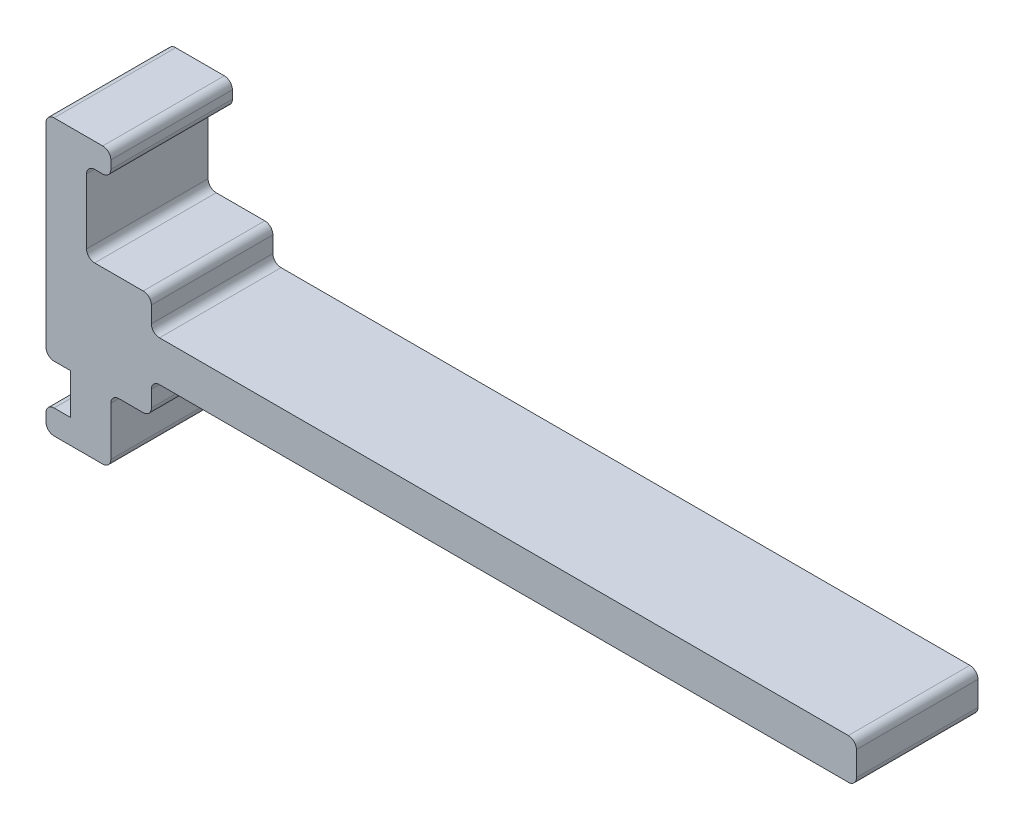
ISO-10303-21;
HEADER;
FILE_DESCRIPTION(('STEP AP214'),'2;1');
FILE_NAME('part.step','',(''),(''),'','','');
FILE_SCHEMA(('AUTOMOTIVE_DESIGN { 1 0 10303 214 1 1 1 1 }'));
ENDSEC;
DATA;
#1=APPLICATION_CONTEXT('core data for automotive mechanical design processes');
#2=APPLICATION_PROTOCOL_DEFINITION('international standard','automotive_design',2000,#1);
#3=PRODUCT_CONTEXT('',#1,'mechanical');
#4=PRODUCT('Part','Part','',(#3));
#5=PRODUCT_RELATED_PRODUCT_CATEGORY('part','',(#4));
#6=PRODUCT_DEFINITION_FORMATION('','',#4);
#7=PRODUCT_DEFINITION_CONTEXT('part definition',#1,'design');
#8=PRODUCT_DEFINITION('design','',#6,#7);
#9=PRODUCT_DEFINITION_SHAPE('','',#8);
#10=(LENGTH_UNIT() NAMED_UNIT(*) SI_UNIT(.MILLI.,.METRE.));
#11=(NAMED_UNIT(*) PLANE_ANGLE_UNIT() SI_UNIT($,.RADIAN.));
#12=(NAMED_UNIT(*) SI_UNIT($,.STERADIAN.) SOLID_ANGLE_UNIT());
#13=UNCERTAINTY_MEASURE_WITH_UNIT(LENGTH_MEASURE(1.E-05),#10,'distance_accuracy_value','');
#14=(GEOMETRIC_REPRESENTATION_CONTEXT(3) GLOBAL_UNCERTAINTY_ASSIGNED_CONTEXT((#13)) GLOBAL_UNIT_ASSIGNED_CONTEXT((#10,
#11,#12)) REPRESENTATION_CONTEXT('',''));
#15=CARTESIAN_POINT('',(0.,0.,0.));
#16=DIRECTION('',(0.,0.,1.));
#17=DIRECTION('',(1.,0.,0.));
#18=AXIS2_PLACEMENT_3D('',#15,#16,#17);
#19=CARTESIAN_POINT('',(-36.,3.5,7.5));
#20=DIRECTION('',(0.,0.,-1.));
#21=DIRECTION('',(-1.,0.,0.));
#22=AXIS2_PLACEMENT_3D('',#19,#20,#21);
#23=CYLINDRICAL_SURFACE('',#22,1.);
#24=CARTESIAN_POINT('',(-36.,3.5,-7.5));
#25=DIRECTION('',(0.,0.,1.));
#26=DIRECTION('',(1.,0.,0.));
#27=AXIS2_PLACEMENT_3D('',#24,#25,#26);
#28=CIRCLE('',#27,1.);
#29=CARTESIAN_POINT('',(-37.,3.50000000000001,-7.5));
#30=VERTEX_POINT('',#29);
#31=CARTESIAN_POINT('',(-36.,2.5,-7.5));
#32=VERTEX_POINT('',#31);
#33=EDGE_CURVE('E302',#30,#32,#28,.T.);
#34=ORIENTED_EDGE('',*,*,#33,.F.);
#35=DIRECTION('',(0.,0.,-1.));
#36=VECTOR('',#35,1.);
#37=CARTESIAN_POINT('',(-37.,3.50000000000001,7.5));
#38=LINE('',#37,#36);
#39=CARTESIAN_POINT('',(-37.,3.50000000000001,7.5));
#40=VERTEX_POINT('',#39);
#41=EDGE_CURVE('E11',#40,#30,#38,.T.);
#42=ORIENTED_EDGE('',*,*,#41,.F.);
#43=CARTESIAN_POINT('',(-36.,3.5,7.5));
#44=DIRECTION('',(0.,0.,1.));
#45=DIRECTION('',(1.,0.,0.));
#46=AXIS2_PLACEMENT_3D('',#43,#44,#45);
#47=CIRCLE('',#46,1.);
#48=CARTESIAN_POINT('',(-36.,2.5,7.5));
#49=VERTEX_POINT('',#48);
#50=EDGE_CURVE('E431',#40,#49,#47,.T.);
#51=ORIENTED_EDGE('',*,*,#50,.T.);
#52=DIRECTION('',(0.,0.,-1.));
#53=VECTOR('',#52,1.);
#54=CARTESIAN_POINT('',(-36.,2.5,7.5));
#55=LINE('',#54,#53);
#56=EDGE_CURVE('E46',#49,#32,#55,.T.);
#57=ORIENTED_EDGE('',*,*,#56,.T.);
#58=EDGE_LOOP('',(#34,#42,#51,#57));
#59=FACE_BOUND('',#58,.T.);
#60=ADVANCED_FACE('F43',(#59),#23,.F.);
#61=CARTESIAN_POINT('',(-37.,5.5,7.5));
#62=DIRECTION('',(1.,0.,0.));
#63=DIRECTION('',(0.,0.,-1.));
#64=AXIS2_PLACEMENT_3D('',#61,#62,#63);
#65=PLANE('',#64);
#66=DIRECTION('',(0.,-1.,0.));
#67=VECTOR('',#66,1.);
#68=CARTESIAN_POINT('',(-37.,5.5,-7.5));
#69=LINE('',#68,#67);
#70=CARTESIAN_POINT('',(-37.,5.5,-7.5));
#71=VERTEX_POINT('',#70);
#72=EDGE_CURVE('E428',#71,#30,#69,.T.);
#73=ORIENTED_EDGE('',*,*,#72,.F.);
#74=DIRECTION('',(0.,0.,-1.));
#75=VECTOR('',#74,1.);
#76=CARTESIAN_POINT('',(-37.,5.5,7.5));
#77=LINE('',#76,#75);
#78=CARTESIAN_POINT('',(-37.,5.5,7.5));
#79=VERTEX_POINT('',#78);
#80=EDGE_CURVE('E53',#79,#71,#77,.T.);
#81=ORIENTED_EDGE('',*,*,#80,.F.);
#82=DIRECTION('',(0.,-1.,0.));
#83=VECTOR('',#82,1.);
#84=CARTESIAN_POINT('',(-37.,5.5,7.5));
#85=LINE('',#84,#83);
#86=EDGE_CURVE('E279',#79,#40,#85,.T.);
#87=ORIENTED_EDGE('',*,*,#86,.T.);
#88=ORIENTED_EDGE('',*,*,#41,.T.);
#89=EDGE_LOOP('',(#73,#81,#87,#88));
#90=FACE_BOUND('',#89,.T.);
#91=ADVANCED_FACE('F533',(#90),#65,.T.);
#92=CARTESIAN_POINT('',(-38.,5.5,7.5));
#93=DIRECTION('',(0.,0.,-1.));
#94=DIRECTION('',(-1.,0.,0.));
#95=AXIS2_PLACEMENT_3D('',#92,#93,#94);
#96=CYLINDRICAL_SURFACE('',#95,1.);
#97=CARTESIAN_POINT('',(-38.,5.5,-7.5));
#98=DIRECTION('',(0.,0.,1.));
#99=DIRECTION('',(1.,0.,0.));
#100=AXIS2_PLACEMENT_3D('',#97,#98,#99);
#101=CIRCLE('',#100,1.);
#102=CARTESIAN_POINT('',(-38.,6.5,-7.5));
#103=VERTEX_POINT('',#102);
#104=EDGE_CURVE('E284',#71,#103,#101,.T.);
#105=ORIENTED_EDGE('',*,*,#104,.T.);
#106=DIRECTION('',(0.,0.,-1.));
#107=VECTOR('',#106,1.);
#108=CARTESIAN_POINT('',(-38.,6.5,7.5));
#109=LINE('',#108,#107);
#110=CARTESIAN_POINT('',(-38.,6.5,7.5));
#111=VERTEX_POINT('',#110);
#112=EDGE_CURVE('E282',#111,#103,#109,.T.);
#113=ORIENTED_EDGE('',*,*,#112,.F.);
#114=CARTESIAN_POINT('',(-38.,5.5,7.5));
#115=DIRECTION('',(0.,0.,1.));
#116=DIRECTION('',(1.,0.,0.));
#117=AXIS2_PLACEMENT_3D('',#114,#115,#116);
#118=CIRCLE('',#117,1.);
#119=EDGE_CURVE('E272',#79,#111,#118,.T.);
#120=ORIENTED_EDGE('',*,*,#119,.F.);
#121=ORIENTED_EDGE('',*,*,#80,.T.);
#122=EDGE_LOOP('',(#105,#113,#120,#121));
#123=FACE_BOUND('',#122,.T.);
#124=ADVANCED_FACE('F283',(#123),#96,.T.);
#125=CARTESIAN_POINT('',(-44.,6.5,7.5));
#126=DIRECTION('',(0.,1.,0.));
#127=DIRECTION('',(0.,0.,1.));
#128=AXIS2_PLACEMENT_3D('',#125,#126,#127);
#129=PLANE('',#128);
#130=DIRECTION('',(1.,0.,0.));
#131=VECTOR('',#130,1.);
#132=CARTESIAN_POINT('',(-44.,6.5,-7.5));
#133=LINE('',#132,#131);
#134=CARTESIAN_POINT('',(-44.,6.5,-7.5));
#135=VERTEX_POINT('',#134);
#136=EDGE_CURVE('E423',#135,#103,#133,.T.);
#137=ORIENTED_EDGE('',*,*,#136,.F.);
#138=DIRECTION('',(0.,0.,-1.));
#139=VECTOR('',#138,1.);
#140=CARTESIAN_POINT('',(-44.,6.5,7.5));
#141=LINE('',#140,#139);
#142=CARTESIAN_POINT('',(-44.,6.5,7.5));
#143=VERTEX_POINT('',#142);
#144=EDGE_CURVE('E289',#143,#135,#141,.T.);
#145=ORIENTED_EDGE('',*,*,#144,.F.);
#146=DIRECTION('',(1.,0.,0.));
#147=VECTOR('',#146,1.);
#148=CARTESIAN_POINT('',(-44.,6.5,7.5));
#149=LINE('',#148,#147);
#150=EDGE_CURVE('E277',#143,#111,#149,.T.);
#151=ORIENTED_EDGE('',*,*,#150,.T.);
#152=ORIENTED_EDGE('',*,*,#112,.T.);
#153=EDGE_LOOP('',(#137,#145,#151,#152));
#154=FACE_BOUND('',#153,.T.);
#155=ADVANCED_FACE('F291',(#154),#129,.T.);
#156=CARTESIAN_POINT('',(-44.,7.5,7.5));
#157=DIRECTION('',(0.,0.,-1.));
#158=DIRECTION('',(-1.,0.,0.));
#159=AXIS2_PLACEMENT_3D('',#156,#157,#158);
#160=CYLINDRICAL_SURFACE('',#159,1.);
#161=CARTESIAN_POINT('',(-44.,7.5,-7.5));
#162=DIRECTION('',(0.,0.,1.));
#163=DIRECTION('',(1.,0.,0.));
#164=AXIS2_PLACEMENT_3D('',#161,#162,#163);
#165=CIRCLE('',#164,1.);
#166=CARTESIAN_POINT('',(-45.,7.50000000000001,-7.5));
#167=VERTEX_POINT('',#166);
#168=EDGE_CURVE('E419',#167,#135,#165,.T.);
#169=ORIENTED_EDGE('',*,*,#168,.F.);
#170=DIRECTION('',(0.,0.,-1.));
#171=VECTOR('',#170,1.);
#172=CARTESIAN_POINT('',(-45.,7.50000000000001,7.5));
#173=LINE('',#172,#171);
#174=CARTESIAN_POINT('',(-45.,7.50000000000001,7.5));
#175=VERTEX_POINT('',#174);
#176=EDGE_CURVE('E437',#175,#167,#173,.T.);
#177=ORIENTED_EDGE('',*,*,#176,.F.);
#178=CARTESIAN_POINT('',(-44.,7.5,7.5));
#179=DIRECTION('',(0.,0.,1.));
#180=DIRECTION('',(1.,0.,0.));
#181=AXIS2_PLACEMENT_3D('',#178,#179,#180);
#182=CIRCLE('',#181,1.);
#183=EDGE_CURVE('E293',#175,#143,#182,.T.);
#184=ORIENTED_EDGE('',*,*,#183,.T.);
#185=ORIENTED_EDGE('',*,*,#144,.T.);
#186=EDGE_LOOP('',(#169,#177,#184,#185));
#187=FACE_BOUND('',#186,.T.);
#188=ADVANCED_FACE('F546',(#187),#160,.F.);
#189=CARTESIAN_POINT('',(-45.,15.5,7.5));
#190=DIRECTION('',(1.,0.,0.));
#191=DIRECTION('',(0.,0.,-1.));
#192=AXIS2_PLACEMENT_3D('',#189,#190,#191);
#193=PLANE('',#192);
#194=DIRECTION('',(0.,-1.,0.));
#195=VECTOR('',#194,1.);
#196=CARTESIAN_POINT('',(-45.,15.5,-7.5));
#197=LINE('',#196,#195);
#198=CARTESIAN_POINT('',(-45.,15.5,-7.5));
#199=VERTEX_POINT('',#198);
#200=EDGE_CURVE('E415',#199,#167,#197,.T.);
#201=ORIENTED_EDGE('',*,*,#200,.F.);
#202=DIRECTION('',(0.,0.,-1.));
#203=VECTOR('',#202,1.);
#204=CARTESIAN_POINT('',(-45.,15.5,7.5));
#205=LINE('',#204,#203);
#206=CARTESIAN_POINT('',(-45.,15.5,7.5));
#207=VERTEX_POINT('',#206);
#208=EDGE_CURVE('E440',#207,#199,#205,.T.);
#209=ORIENTED_EDGE('',*,*,#208,.F.);
#210=DIRECTION('',(0.,-1.,0.));
#211=VECTOR('',#210,1.);
#212=CARTESIAN_POINT('',(-45.,15.5,7.5));
#213=LINE('',#212,#211);
#214=EDGE_CURVE('E296',#207,#175,#213,.T.);
#215=ORIENTED_EDGE('',*,*,#214,.T.);
#216=ORIENTED_EDGE('',*,*,#176,.T.);
#217=EDGE_LOOP('',(#201,#209,#215,#216));
#218=FACE_BOUND('',#217,.T.);
#219=ADVANCED_FACE('F549',(#218),#193,.T.);
#220=CARTESIAN_POINT('',(-44.,15.5,7.5));
#221=DIRECTION('',(0.,0.,-1.));
#222=DIRECTION('',(-1.,0.,0.));
#223=AXIS2_PLACEMENT_3D('',#220,#221,#222);
#224=CYLINDRICAL_SURFACE('',#223,1.);
#225=CARTESIAN_POINT('',(-44.,15.5,-7.5));
#226=DIRECTION('',(0.,0.,1.));
#227=DIRECTION('',(1.,0.,0.));
#228=AXIS2_PLACEMENT_3D('',#225,#226,#227);
#229=CIRCLE('',#228,1.);
#230=CARTESIAN_POINT('',(-44.,16.5,-7.5));
#231=VERTEX_POINT('',#230);
#232=EDGE_CURVE('E411',#231,#199,#229,.T.);
#233=ORIENTED_EDGE('',*,*,#232,.F.);
#234=DIRECTION('',(0.,0.,-1.));
#235=VECTOR('',#234,1.);
#236=CARTESIAN_POINT('',(-44.,16.5,7.5));
#237=LINE('',#236,#235);
#238=CARTESIAN_POINT('',(-44.,16.5,7.5));
#239=VERTEX_POINT('',#238);
#240=EDGE_CURVE('E443',#239,#231,#237,.T.);
#241=ORIENTED_EDGE('',*,*,#240,.F.);
#242=CARTESIAN_POINT('',(-44.,15.5,7.5));
#243=DIRECTION('',(0.,0.,1.));
#244=DIRECTION('',(1.,0.,0.));
#245=AXIS2_PLACEMENT_3D('',#242,#243,#244);
#246=CIRCLE('',#245,1.);
#247=EDGE_CURVE('E1060',#239,#207,#246,.T.);
#248=ORIENTED_EDGE('',*,*,#247,.T.);
#249=ORIENTED_EDGE('',*,*,#208,.T.);
#250=EDGE_LOOP('',(#233,#241,#248,#249));
#251=FACE_BOUND('',#250,.T.);
#252=ADVANCED_FACE('F553',(#251),#224,.F.);
#253=CARTESIAN_POINT('',(-43.,16.5,7.5));
#254=DIRECTION('',(0.,-1.,0.));
#255=DIRECTION('',(0.,0.,-1.));
#256=AXIS2_PLACEMENT_3D('',#253,#254,#255);
#257=PLANE('',#256);
#258=DIRECTION('',(-1.,0.,0.));
#259=VECTOR('',#258,1.);
#260=CARTESIAN_POINT('',(-43.,16.5,-7.5));
#261=LINE('',#260,#259);
#262=CARTESIAN_POINT('',(-43.,16.5,-7.5));
#263=VERTEX_POINT('',#262);
#264=EDGE_CURVE('E407',#263,#231,#261,.T.);
#265=ORIENTED_EDGE('',*,*,#264,.F.);
#266=DIRECTION('',(0.,0.,-1.));
#267=VECTOR('',#266,1.);
#268=CARTESIAN_POINT('',(-43.,16.5,7.5));
#269=LINE('',#268,#267);
#270=CARTESIAN_POINT('',(-43.,16.5,7.5));
#271=VERTEX_POINT('',#270);
#272=EDGE_CURVE('E446',#271,#263,#269,.T.);
#273=ORIENTED_EDGE('',*,*,#272,.F.);
#274=DIRECTION('',(-1.,0.,0.));
#275=VECTOR('',#274,1.);
#276=CARTESIAN_POINT('',(-43.,16.5,7.5));
#277=LINE('',#276,#275);
#278=EDGE_CURVE('E1056',#271,#239,#277,.T.);
#279=ORIENTED_EDGE('',*,*,#278,.T.);
#280=ORIENTED_EDGE('',*,*,#240,.T.);
#281=EDGE_LOOP('',(#265,#273,#279,#280));
#282=FACE_BOUND('',#281,.T.);
#283=ADVANCED_FACE('F557',(#282),#257,.T.);
#284=CARTESIAN_POINT('',(-43.,17.5,7.5));
#285=DIRECTION('',(0.,0.,-1.));
#286=DIRECTION('',(-1.,0.,0.));
#287=AXIS2_PLACEMENT_3D('',#284,#285,#286);
#288=CYLINDRICAL_SURFACE('',#287,1.);
#289=CARTESIAN_POINT('',(-43.,17.5,-7.5));
#290=DIRECTION('',(0.,0.,1.));
#291=DIRECTION('',(1.,0.,0.));
#292=AXIS2_PLACEMENT_3D('',#289,#290,#291);
#293=CIRCLE('',#292,1.);
#294=CARTESIAN_POINT('',(-42.,17.5,-7.5));
#295=VERTEX_POINT('',#294);
#296=EDGE_CURVE('E403',#263,#295,#293,.T.);
#297=ORIENTED_EDGE('',*,*,#296,.T.);
#298=DIRECTION('',(0.,0.,-1.));
#299=VECTOR('',#298,1.);
#300=CARTESIAN_POINT('',(-42.,17.5,7.5));
#301=LINE('',#300,#299);
#302=CARTESIAN_POINT('',(-42.,17.5,7.5));
#303=VERTEX_POINT('',#302);
#304=EDGE_CURVE('E449',#303,#295,#301,.T.);
#305=ORIENTED_EDGE('',*,*,#304,.F.);
#306=CARTESIAN_POINT('',(-43.,17.5,7.5));
#307=DIRECTION('',(0.,0.,1.));
#308=DIRECTION('',(1.,0.,0.));
#309=AXIS2_PLACEMENT_3D('',#306,#307,#308);
#310=CIRCLE('',#309,1.);
#311=EDGE_CURVE('E1053',#271,#303,#310,.T.);
#312=ORIENTED_EDGE('',*,*,#311,.F.);
#313=ORIENTED_EDGE('',*,*,#272,.T.);
#314=EDGE_LOOP('',(#297,#305,#312,#313));
#315=FACE_BOUND('',#314,.T.);
#316=ADVANCED_FACE('F561',(#315),#288,.T.);
#317=CARTESIAN_POINT('',(-42.,18.5,7.5));
#318=DIRECTION('',(1.,0.,0.));
#319=DIRECTION('',(0.,0.,-1.));
#320=AXIS2_PLACEMENT_3D('',#317,#318,#319);
#321=PLANE('',#320);
#322=DIRECTION('',(0.,-1.,0.));
#323=VECTOR('',#322,1.);
#324=CARTESIAN_POINT('',(-42.,18.5,-7.5));
#325=LINE('',#324,#323);
#326=CARTESIAN_POINT('',(-42.,18.5,-7.5));
#327=VERTEX_POINT('',#326);
#328=EDGE_CURVE('E399',#327,#295,#325,.T.);
#329=ORIENTED_EDGE('',*,*,#328,.F.);
#330=DIRECTION('',(0.,0.,-1.));
#331=VECTOR('',#330,1.);
#332=CARTESIAN_POINT('',(-42.,18.5,7.5));
#333=LINE('',#332,#331);
#334=CARTESIAN_POINT('',(-42.,18.5,7.5));
#335=VERTEX_POINT('',#334);
#336=EDGE_CURVE('E452',#335,#327,#333,.T.);
#337=ORIENTED_EDGE('',*,*,#336,.F.);
#338=DIRECTION('',(0.,-1.,0.));
#339=VECTOR('',#338,1.);
#340=CARTESIAN_POINT('',(-42.,18.5,7.5));
#341=LINE('',#340,#339);
#342=EDGE_CURVE('E1045',#335,#303,#341,.T.);
#343=ORIENTED_EDGE('',*,*,#342,.T.);
#344=ORIENTED_EDGE('',*,*,#304,.T.);
#345=EDGE_LOOP('',(#329,#337,#343,#344));
#346=FACE_BOUND('',#345,.T.);
#347=ADVANCED_FACE('F565',(#346),#321,.T.);
#348=CARTESIAN_POINT('',(-43.,18.5,7.5));
#349=DIRECTION('',(0.,0.,-1.));
#350=DIRECTION('',(-1.,0.,0.));
#351=AXIS2_PLACEMENT_3D('',#348,#349,#350);
#352=CYLINDRICAL_SURFACE('',#351,1.);
#353=CARTESIAN_POINT('',(-43.,18.5,-7.5));
#354=DIRECTION('',(0.,0.,1.));
#355=DIRECTION('',(1.,0.,0.));
#356=AXIS2_PLACEMENT_3D('',#353,#354,#355);
#357=CIRCLE('',#356,1.);
#358=CARTESIAN_POINT('',(-43.,19.5,-7.5));
#359=VERTEX_POINT('',#358);
#360=EDGE_CURVE('E395',#327,#359,#357,.T.);
#361=ORIENTED_EDGE('',*,*,#360,.T.);
#362=DIRECTION('',(0.,0.,-1.));
#363=VECTOR('',#362,1.);
#364=CARTESIAN_POINT('',(-43.,19.5,7.5));
#365=LINE('',#364,#363);
#366=CARTESIAN_POINT('',(-43.,19.5,7.5));
#367=VERTEX_POINT('',#366);
#368=EDGE_CURVE('E455',#367,#359,#365,.T.);
#369=ORIENTED_EDGE('',*,*,#368,.F.);
#370=CARTESIAN_POINT('',(-43.,18.5,7.5));
#371=DIRECTION('',(0.,0.,1.));
#372=DIRECTION('',(1.,0.,0.));
#373=AXIS2_PLACEMENT_3D('',#370,#371,#372);
#374=CIRCLE('',#373,1.);
#375=EDGE_CURVE('E1039',#335,#367,#374,.T.);
#376=ORIENTED_EDGE('',*,*,#375,.F.);
#377=ORIENTED_EDGE('',*,*,#336,.T.);
#378=EDGE_LOOP('',(#361,#369,#376,#377));
#379=FACE_BOUND('',#378,.T.);
#380=ADVANCED_FACE('F569',(#379),#352,.T.);
#381=CARTESIAN_POINT('',(-45.,19.5,7.5));
#382=DIRECTION('',(0.,1.,0.));
#383=DIRECTION('',(0.,0.,1.));
#384=AXIS2_PLACEMENT_3D('',#381,#382,#383);
#385=PLANE('',#384);
#386=DIRECTION('',(1.,0.,0.));
#387=VECTOR('',#386,1.);
#388=CARTESIAN_POINT('',(-45.,19.5,-7.5));
#389=LINE('',#388,#387);
#390=CARTESIAN_POINT('',(-49.,19.5,-7.5));
#391=VERTEX_POINT('',#390);
#392=EDGE_CURVE('E391',#391,#359,#389,.T.);
#393=ORIENTED_EDGE('',*,*,#392,.F.);
#394=DIRECTION('',(0.,0.,-1.));
#395=VECTOR('',#394,1.);
#396=CARTESIAN_POINT('',(-49.,19.5,7.5));
#397=LINE('',#396,#395);
#398=CARTESIAN_POINT('',(-49.,19.5,7.5));
#399=VERTEX_POINT('',#398);
#400=EDGE_CURVE('E458',#399,#391,#397,.T.);
#401=ORIENTED_EDGE('',*,*,#400,.F.);
#402=DIRECTION('',(1.,0.,0.));
#403=VECTOR('',#402,1.);
#404=CARTESIAN_POINT('',(-49.,19.5,7.5));
#405=LINE('',#404,#403);
#406=EDGE_CURVE('E1035',#399,#367,#405,.T.);
#407=ORIENTED_EDGE('',*,*,#406,.T.);
#408=ORIENTED_EDGE('',*,*,#368,.T.);
#409=EDGE_LOOP('',(#393,#401,#407,#408));
#410=FACE_BOUND('',#409,.T.);
#411=ADVANCED_FACE('F573',(#410),#385,.T.);
#412=CARTESIAN_POINT('',(-49.,18.5,7.5));
#413=DIRECTION('',(0.,0.,-1.));
#414=DIRECTION('',(-1.,0.,0.));
#415=AXIS2_PLACEMENT_3D('',#412,#413,#414);
#416=CYLINDRICAL_SURFACE('',#415,1.);
#417=CARTESIAN_POINT('',(-49.,18.5,-7.5));
#418=DIRECTION('',(0.,0.,-1.));
#419=DIRECTION('',(-1.,0.,0.));
#420=AXIS2_PLACEMENT_3D('',#417,#418,#419);
#421=CIRCLE('',#420,1.);
#422=CARTESIAN_POINT('',(-50.,18.5,-7.5));
#423=VERTEX_POINT('',#422);
#424=EDGE_CURVE('E387',#423,#391,#421,.T.);
#425=ORIENTED_EDGE('',*,*,#424,.F.);
#426=DIRECTION('',(0.,0.,-1.));
#427=VECTOR('',#426,1.);
#428=CARTESIAN_POINT('',(-50.,18.5,7.5));
#429=LINE('',#428,#427);
#430=CARTESIAN_POINT('',(-50.,18.5,7.5));
#431=VERTEX_POINT('',#430);
#432=EDGE_CURVE('E462',#431,#423,#429,.T.);
#433=ORIENTED_EDGE('',*,*,#432,.F.);
#434=CARTESIAN_POINT('',(-49.,18.5,7.5));
#435=DIRECTION('',(0.,0.,-1.));
#436=DIRECTION('',(-1.,0.,0.));
#437=AXIS2_PLACEMENT_3D('',#434,#435,#436);
#438=CIRCLE('',#437,1.);
#439=EDGE_CURVE('E1033',#431,#399,#438,.T.);
#440=ORIENTED_EDGE('',*,*,#439,.T.);
#441=ORIENTED_EDGE('',*,*,#400,.T.);
#442=EDGE_LOOP('',(#425,#433,#440,#441));
#443=FACE_BOUND('',#442,.T.);
#444=ADVANCED_FACE('F577',(#443),#416,.T.);
#445=CARTESIAN_POINT('',(-50.,2.5,7.5));
#446=DIRECTION('',(-1.,0.,0.));
#447=DIRECTION('',(0.,0.,1.));
#448=AXIS2_PLACEMENT_3D('',#445,#446,#447);
#449=PLANE('',#448);
#450=DIRECTION('',(0.,1.,0.));
#451=VECTOR('',#450,1.);
#452=CARTESIAN_POINT('',(-50.,2.5,-7.5));
#453=LINE('',#452,#451);
#454=CARTESIAN_POINT('',(-50.,-5.5,-7.5));
#455=VERTEX_POINT('',#454);
#456=EDGE_CURVE('E383',#455,#423,#453,.T.);
#457=ORIENTED_EDGE('',*,*,#456,.F.);
#458=DIRECTION('',(0.,0.,-1.));
#459=VECTOR('',#458,1.);
#460=CARTESIAN_POINT('',(-50.,-5.5,7.5));
#461=LINE('',#460,#459);
#462=CARTESIAN_POINT('',(-50.,-5.5,7.5));
#463=VERTEX_POINT('',#462);
#464=EDGE_CURVE('E465',#463,#455,#461,.T.);
#465=ORIENTED_EDGE('',*,*,#464,.F.);
#466=DIRECTION('',(0.,-1.,0.));
#467=VECTOR('',#466,1.);
#468=CARTESIAN_POINT('',(-50.,-2.5,7.5));
#469=LINE('',#468,#467);
#470=EDGE_CURVE('E1030',#431,#463,#469,.T.);
#471=ORIENTED_EDGE('',*,*,#470,.F.);
#472=ORIENTED_EDGE('',*,*,#432,.T.);
#473=EDGE_LOOP('',(#457,#465,#471,#472));
#474=FACE_BOUND('',#473,.T.);
#475=ADVANCED_FACE('F581',(#474),#449,.T.);
#476=CARTESIAN_POINT('',(-49.,-5.5,7.5));
#477=DIRECTION('',(0.,0.,-1.));
#478=DIRECTION('',(-1.,0.,0.));
#479=AXIS2_PLACEMENT_3D('',#476,#477,#478);
#480=CYLINDRICAL_SURFACE('',#479,1.);
#481=CARTESIAN_POINT('',(-49.,-5.5,-7.5));
#482=DIRECTION('',(0.,0.,-1.));
#483=DIRECTION('',(-1.,0.,0.));
#484=AXIS2_PLACEMENT_3D('',#481,#482,#483);
#485=CIRCLE('',#484,1.);
#486=CARTESIAN_POINT('',(-49.,-6.5,-7.5));
#487=VERTEX_POINT('',#486);
#488=EDGE_CURVE('E379',#487,#455,#485,.T.);
#489=ORIENTED_EDGE('',*,*,#488,.F.);
#490=DIRECTION('',(0.,0.,-1.));
#491=VECTOR('',#490,1.);
#492=CARTESIAN_POINT('',(-49.,-6.5,7.5));
#493=LINE('',#492,#491);
#494=CARTESIAN_POINT('',(-49.,-6.5,7.5));
#495=VERTEX_POINT('',#494);
#496=EDGE_CURVE('E469',#495,#487,#493,.T.);
#497=ORIENTED_EDGE('',*,*,#496,.F.);
#498=CARTESIAN_POINT('',(-49.,-5.5,7.5));
#499=DIRECTION('',(0.,0.,-1.));
#500=DIRECTION('',(-1.,0.,0.));
#501=AXIS2_PLACEMENT_3D('',#498,#499,#500);
#502=CIRCLE('',#501,1.);
#503=EDGE_CURVE('E1026',#495,#463,#502,.T.);
#504=ORIENTED_EDGE('',*,*,#503,.T.);
#505=ORIENTED_EDGE('',*,*,#464,.T.);
#506=EDGE_LOOP('',(#489,#497,#504,#505));
#507=FACE_BOUND('',#506,.T.);
#508=ADVANCED_FACE('F585',(#507),#480,.T.);
#509=CARTESIAN_POINT('',(-49.,-6.5,7.5));
#510=DIRECTION('',(0.,1.,0.));
#511=DIRECTION('',(0.,0.,1.));
#512=AXIS2_PLACEMENT_3D('',#509,#510,#511);
#513=PLANE('',#512);
#514=DIRECTION('',(1.,0.,0.));
#515=VECTOR('',#514,1.);
#516=CARTESIAN_POINT('',(-49.,-6.5,-7.5));
#517=LINE('',#516,#515);
#518=CARTESIAN_POINT('',(-47.,-6.5,-7.5));
#519=VERTEX_POINT('',#518);
#520=EDGE_CURVE('E376',#487,#519,#517,.T.);
#521=ORIENTED_EDGE('',*,*,#520,.T.);
#522=DIRECTION('',(0.,0.,-1.));
#523=VECTOR('',#522,1.);
#524=CARTESIAN_POINT('',(-47.,-6.5,7.5));
#525=LINE('',#524,#523);
#526=CARTESIAN_POINT('',(-47.,-6.5,7.5));
#527=VERTEX_POINT('',#526);
#528=EDGE_CURVE('E472',#527,#519,#525,.T.);
#529=ORIENTED_EDGE('',*,*,#528,.F.);
#530=DIRECTION('',(1.,0.,0.));
#531=VECTOR('',#530,1.);
#532=CARTESIAN_POINT('',(-49.,-6.5,7.5));
#533=LINE('',#532,#531);
#534=EDGE_CURVE('E1023',#495,#527,#533,.T.);
#535=ORIENTED_EDGE('',*,*,#534,.F.);
#536=ORIENTED_EDGE('',*,*,#496,.T.);
#537=EDGE_LOOP('',(#521,#529,#535,#536));
#538=FACE_BOUND('',#537,.T.);
#539=ADVANCED_FACE('F589',(#538),#513,.F.);
#540=CARTESIAN_POINT('',(-47.,-6.5,7.5));
#541=DIRECTION('',(1.,0.,0.));
#542=DIRECTION('',(0.,0.,-1.));
#543=AXIS2_PLACEMENT_3D('',#540,#541,#542);
#544=PLANE('',#543);
#545=DIRECTION('',(0.,-1.,0.));
#546=VECTOR('',#545,1.);
#547=CARTESIAN_POINT('',(-47.,-6.5,-7.5));
#548=LINE('',#547,#546);
#549=CARTESIAN_POINT('',(-47.,-11.5,-7.5));
#550=VERTEX_POINT('',#549);
#551=EDGE_CURVE('E373',#519,#550,#548,.T.);
#552=ORIENTED_EDGE('',*,*,#551,.T.);
#553=DIRECTION('',(0.,0.,-1.));
#554=VECTOR('',#553,1.);
#555=CARTESIAN_POINT('',(-47.,-11.5,7.5));
#556=LINE('',#555,#554);
#557=CARTESIAN_POINT('',(-47.,-11.5,7.5));
#558=VERTEX_POINT('',#557);
#559=EDGE_CURVE('E476',#558,#550,#556,.T.);
#560=ORIENTED_EDGE('',*,*,#559,.F.);
#561=DIRECTION('',(0.,-1.,0.));
#562=VECTOR('',#561,1.);
#563=CARTESIAN_POINT('',(-47.,-6.5,7.5));
#564=LINE('',#563,#562);
#565=EDGE_CURVE('E1021',#527,#558,#564,.T.);
#566=ORIENTED_EDGE('',*,*,#565,.F.);
#567=ORIENTED_EDGE('',*,*,#528,.T.);
#568=EDGE_LOOP('',(#552,#560,#566,#567));
#569=FACE_BOUND('',#568,.T.);
#570=ADVANCED_FACE('F593',(#569),#544,.F.);
#571=CARTESIAN_POINT('',(-47.,-11.5,7.5));
#572=DIRECTION('',(0.,-1.,0.));
#573=DIRECTION('',(0.,0.,-1.));
#574=AXIS2_PLACEMENT_3D('',#571,#572,#573);
#575=PLANE('',#574);
#576=DIRECTION('',(-1.,0.,0.));
#577=VECTOR('',#576,1.);
#578=CARTESIAN_POINT('',(-47.,-11.5,-7.5));
#579=LINE('',#578,#577);
#580=CARTESIAN_POINT('',(-49.,-11.5,-7.5));
#581=VERTEX_POINT('',#580);
#582=EDGE_CURVE('E369',#550,#581,#579,.T.);
#583=ORIENTED_EDGE('',*,*,#582,.T.);
#584=DIRECTION('',(0.,0.,-1.));
#585=VECTOR('',#584,1.);
#586=CARTESIAN_POINT('',(-49.,-11.5,7.5));
#587=LINE('',#586,#585);
#588=CARTESIAN_POINT('',(-49.,-11.5,7.5));
#589=VERTEX_POINT('',#588);
#590=EDGE_CURVE('E480',#589,#581,#587,.T.);
#591=ORIENTED_EDGE('',*,*,#590,.F.);
#592=DIRECTION('',(-1.,0.,0.));
#593=VECTOR('',#592,1.);
#594=CARTESIAN_POINT('',(-47.,-11.5,7.5));
#595=LINE('',#594,#593);
#596=EDGE_CURVE('E1085',#558,#589,#595,.T.);
#597=ORIENTED_EDGE('',*,*,#596,.F.);
#598=ORIENTED_EDGE('',*,*,#559,.T.);
#599=EDGE_LOOP('',(#583,#591,#597,#598));
#600=FACE_BOUND('',#599,.T.);
#601=ADVANCED_FACE('F597',(#600),#575,.F.);
#602=CARTESIAN_POINT('',(-49.,-12.5,7.5));
#603=DIRECTION('',(0.,0.,-1.));
#604=DIRECTION('',(-1.,0.,0.));
#605=AXIS2_PLACEMENT_3D('',#602,#603,#604);
#606=CYLINDRICAL_SURFACE('',#605,1.);
#607=CARTESIAN_POINT('',(-49.,-12.5,-7.5));
#608=DIRECTION('',(0.,0.,-1.));
#609=DIRECTION('',(-1.,0.,0.));
#610=AXIS2_PLACEMENT_3D('',#607,#608,#609);
#611=CIRCLE('',#610,1.);
#612=CARTESIAN_POINT('',(-50.,-12.5,-7.5));
#613=VERTEX_POINT('',#612);
#614=EDGE_CURVE('E365',#613,#581,#611,.T.);
#615=ORIENTED_EDGE('',*,*,#614,.F.);
#616=DIRECTION('',(0.,0.,-1.));
#617=VECTOR('',#616,1.);
#618=CARTESIAN_POINT('',(-50.,-12.5,7.5));
#619=LINE('',#618,#617);
#620=CARTESIAN_POINT('',(-50.,-12.5,7.5));
#621=VERTEX_POINT('',#620);
#622=EDGE_CURVE('E483',#621,#613,#619,.T.);
#623=ORIENTED_EDGE('',*,*,#622,.F.);
#624=CARTESIAN_POINT('',(-49.,-12.5,7.5));
#625=DIRECTION('',(0.,0.,-1.));
#626=DIRECTION('',(-1.,0.,0.));
#627=AXIS2_PLACEMENT_3D('',#624,#625,#626);
#628=CIRCLE('',#627,1.);
#629=EDGE_CURVE('E1013',#621,#589,#628,.T.);
#630=ORIENTED_EDGE('',*,*,#629,.T.);
#631=ORIENTED_EDGE('',*,*,#590,.T.);
#632=EDGE_LOOP('',(#615,#623,#630,#631));
#633=FACE_BOUND('',#632,.T.);
#634=ADVANCED_FACE('F601',(#633),#606,.T.);
#635=CARTESIAN_POINT('',(-50.,-12.5,7.5));
#636=DIRECTION('',(1.,0.,0.));
#637=DIRECTION('',(0.,0.,-1.));
#638=AXIS2_PLACEMENT_3D('',#635,#636,#637);
#639=PLANE('',#638);
#640=DIRECTION('',(0.,-1.,0.));
#641=VECTOR('',#640,1.);
#642=CARTESIAN_POINT('',(-50.,-12.5,-7.5));
#643=LINE('',#642,#641);
#644=CARTESIAN_POINT('',(-50.,-13.5,-7.5));
#645=VERTEX_POINT('',#644);
#646=EDGE_CURVE('E361',#613,#645,#643,.T.);
#647=ORIENTED_EDGE('',*,*,#646,.T.);
#648=DIRECTION('',(0.,0.,-1.));
#649=VECTOR('',#648,1.);
#650=CARTESIAN_POINT('',(-50.,-13.5,7.5));
#651=LINE('',#650,#649);
#652=CARTESIAN_POINT('',(-50.,-13.5,7.5));
#653=VERTEX_POINT('',#652);
#654=EDGE_CURVE('E486',#653,#645,#651,.T.);
#655=ORIENTED_EDGE('',*,*,#654,.F.);
#656=DIRECTION('',(0.,-1.,0.));
#657=VECTOR('',#656,1.);
#658=CARTESIAN_POINT('',(-50.,-12.5,7.5));
#659=LINE('',#658,#657);
#660=EDGE_CURVE('E1090',#621,#653,#659,.T.);
#661=ORIENTED_EDGE('',*,*,#660,.F.);
#662=ORIENTED_EDGE('',*,*,#622,.T.);
#663=EDGE_LOOP('',(#647,#655,#661,#662));
#664=FACE_BOUND('',#663,.T.);
#665=ADVANCED_FACE('F605',(#664),#639,.F.);
#666=CARTESIAN_POINT('',(-49.,-13.5,7.5));
#667=DIRECTION('',(0.,0.,-1.));
#668=DIRECTION('',(-1.,0.,0.));
#669=AXIS2_PLACEMENT_3D('',#666,#667,#668);
#670=CYLINDRICAL_SURFACE('',#669,1.);
#671=CARTESIAN_POINT('',(-49.,-13.5,-7.5));
#672=DIRECTION('',(0.,0.,-1.));
#673=DIRECTION('',(-1.,0.,0.));
#674=AXIS2_PLACEMENT_3D('',#671,#672,#673);
#675=CIRCLE('',#674,1.);
#676=CARTESIAN_POINT('',(-49.,-14.5,-7.5));
#677=VERTEX_POINT('',#676);
#678=EDGE_CURVE('E357',#677,#645,#675,.T.);
#679=ORIENTED_EDGE('',*,*,#678,.F.);
#680=DIRECTION('',(0.,0.,-1.));
#681=VECTOR('',#680,1.);
#682=CARTESIAN_POINT('',(-49.,-14.5,7.5));
#683=LINE('',#682,#681);
#684=CARTESIAN_POINT('',(-49.,-14.5,7.5));
#685=VERTEX_POINT('',#684);
#686=EDGE_CURVE('E489',#685,#677,#683,.T.);
#687=ORIENTED_EDGE('',*,*,#686,.F.);
#688=CARTESIAN_POINT('',(-49.,-13.5,7.5));
#689=DIRECTION('',(0.,0.,-1.));
#690=DIRECTION('',(-1.,0.,0.));
#691=AXIS2_PLACEMENT_3D('',#688,#689,#690);
#692=CIRCLE('',#691,1.);
#693=EDGE_CURVE('E1006',#685,#653,#692,.T.);
#694=ORIENTED_EDGE('',*,*,#693,.T.);
#695=ORIENTED_EDGE('',*,*,#654,.T.);
#696=EDGE_LOOP('',(#679,#687,#694,#695));
#697=FACE_BOUND('',#696,.T.);
#698=ADVANCED_FACE('F609',(#697),#670,.T.);
#699=CARTESIAN_POINT('',(-49.,-14.5,7.5));
#700=DIRECTION('',(0.,1.,0.));
#701=DIRECTION('',(0.,0.,1.));
#702=AXIS2_PLACEMENT_3D('',#699,#700,#701);
#703=PLANE('',#702);
#704=DIRECTION('',(1.,0.,0.));
#705=VECTOR('',#704,1.);
#706=CARTESIAN_POINT('',(-49.,-14.5,-7.5));
#707=LINE('',#706,#705);
#708=CARTESIAN_POINT('',(-43.,-14.5,-7.5));
#709=VERTEX_POINT('',#708);
#710=EDGE_CURVE('E353',#677,#709,#707,.T.);
#711=ORIENTED_EDGE('',*,*,#710,.T.);
#712=DIRECTION('',(0.,0.,-1.));
#713=VECTOR('',#712,1.);
#714=CARTESIAN_POINT('',(-43.,-14.5,7.5));
#715=LINE('',#714,#713);
#716=CARTESIAN_POINT('',(-43.,-14.5,7.5));
#717=VERTEX_POINT('',#716);
#718=EDGE_CURVE('E492',#717,#709,#715,.T.);
#719=ORIENTED_EDGE('',*,*,#718,.F.);
#720=DIRECTION('',(1.,0.,0.));
#721=VECTOR('',#720,1.);
#722=CARTESIAN_POINT('',(-49.,-14.5,7.5));
#723=LINE('',#722,#721);
#724=EDGE_CURVE('E1095',#685,#717,#723,.T.);
#725=ORIENTED_EDGE('',*,*,#724,.F.);
#726=ORIENTED_EDGE('',*,*,#686,.T.);
#727=EDGE_LOOP('',(#711,#719,#725,#726));
#728=FACE_BOUND('',#727,.T.);
#729=ADVANCED_FACE('F613',(#728),#703,.F.);
#730=CARTESIAN_POINT('',(-43.,-13.5,7.5));
#731=DIRECTION('',(0.,0.,-1.));
#732=DIRECTION('',(-1.,0.,0.));
#733=AXIS2_PLACEMENT_3D('',#730,#731,#732);
#734=CYLINDRICAL_SURFACE('',#733,1.);
#735=CARTESIAN_POINT('',(-43.,-13.5,-7.5));
#736=DIRECTION('',(0.,0.,-1.));
#737=DIRECTION('',(-1.,0.,0.));
#738=AXIS2_PLACEMENT_3D('',#735,#736,#737);
#739=CIRCLE('',#738,1.);
#740=CARTESIAN_POINT('',(-42.,-13.5,-7.5));
#741=VERTEX_POINT('',#740);
#742=EDGE_CURVE('E349',#741,#709,#739,.T.);
#743=ORIENTED_EDGE('',*,*,#742,.F.);
#744=DIRECTION('',(0.,0.,-1.));
#745=VECTOR('',#744,1.);
#746=CARTESIAN_POINT('',(-42.,-13.5,7.5));
#747=LINE('',#746,#745);
#748=CARTESIAN_POINT('',(-42.,-13.5,7.5));
#749=VERTEX_POINT('',#748);
#750=EDGE_CURVE('E495',#749,#741,#747,.T.);
#751=ORIENTED_EDGE('',*,*,#750,.F.);
#752=CARTESIAN_POINT('',(-43.,-13.5,7.5));
#753=DIRECTION('',(0.,0.,-1.));
#754=DIRECTION('',(-1.,0.,0.));
#755=AXIS2_PLACEMENT_3D('',#752,#753,#754);
#756=CIRCLE('',#755,1.);
#757=EDGE_CURVE('E999',#749,#717,#756,.T.);
#758=ORIENTED_EDGE('',*,*,#757,.T.);
#759=ORIENTED_EDGE('',*,*,#718,.T.);
#760=EDGE_LOOP('',(#743,#751,#758,#759));
#761=FACE_BOUND('',#760,.T.);
#762=ADVANCED_FACE('F617',(#761),#734,.T.);
#763=CARTESIAN_POINT('',(-42.,-7.50000000000001,7.5));
#764=DIRECTION('',(1.,0.,0.));
#765=DIRECTION('',(0.,0.,-1.));
#766=AXIS2_PLACEMENT_3D('',#763,#764,#765);
#767=PLANE('',#766);
#768=DIRECTION('',(0.,-1.,0.));
#769=VECTOR('',#768,1.);
#770=CARTESIAN_POINT('',(-42.,-7.50000000000001,-7.5));
#771=LINE('',#770,#769);
#772=CARTESIAN_POINT('',(-42.,-7.50000000000001,-7.5));
#773=VERTEX_POINT('',#772);
#774=EDGE_CURVE('E345',#773,#741,#771,.T.);
#775=ORIENTED_EDGE('',*,*,#774,.F.);
#776=DIRECTION('',(0.,0.,-1.));
#777=VECTOR('',#776,1.);
#778=CARTESIAN_POINT('',(-42.,-7.50000000000001,7.5));
#779=LINE('',#778,#777);
#780=CARTESIAN_POINT('',(-42.,-7.50000000000001,7.5));
#781=VERTEX_POINT('',#780);
#782=EDGE_CURVE('E498',#781,#773,#779,.T.);
#783=ORIENTED_EDGE('',*,*,#782,.F.);
#784=DIRECTION('',(0.,-1.,0.));
#785=VECTOR('',#784,1.);
#786=CARTESIAN_POINT('',(-42.,-7.50000000000001,7.5));
#787=LINE('',#786,#785);
#788=EDGE_CURVE('E995',#781,#749,#787,.T.);
#789=ORIENTED_EDGE('',*,*,#788,.T.);
#790=ORIENTED_EDGE('',*,*,#750,.T.);
#791=EDGE_LOOP('',(#775,#783,#789,#790));
#792=FACE_BOUND('',#791,.T.);
#793=ADVANCED_FACE('F621',(#792),#767,.T.);
#794=CARTESIAN_POINT('',(-41.,-7.5,7.5));
#795=DIRECTION('',(0.,0.,-1.));
#796=DIRECTION('',(-1.,0.,0.));
#797=AXIS2_PLACEMENT_3D('',#794,#795,#796);
#798=CYLINDRICAL_SURFACE('',#797,1.);
#799=CARTESIAN_POINT('',(-41.,-7.5,-7.5));
#800=DIRECTION('',(0.,0.,1.));
#801=DIRECTION('',(1.,0.,0.));
#802=AXIS2_PLACEMENT_3D('',#799,#800,#801);
#803=CIRCLE('',#802,1.);
#804=CARTESIAN_POINT('',(-41.,-6.5,-7.5));
#805=VERTEX_POINT('',#804);
#806=EDGE_CURVE('E341',#805,#773,#803,.T.);
#807=ORIENTED_EDGE('',*,*,#806,.F.);
#808=DIRECTION('',(0.,0.,-1.));
#809=VECTOR('',#808,1.);
#810=CARTESIAN_POINT('',(-41.,-6.5,7.5));
#811=LINE('',#810,#809);
#812=CARTESIAN_POINT('',(-41.,-6.5,7.5));
#813=VERTEX_POINT('',#812);
#814=EDGE_CURVE('E501',#813,#805,#811,.T.);
#815=ORIENTED_EDGE('',*,*,#814,.F.);
#816=CARTESIAN_POINT('',(-41.,-7.5,7.5));
#817=DIRECTION('',(0.,0.,1.));
#818=DIRECTION('',(1.,0.,0.));
#819=AXIS2_PLACEMENT_3D('',#816,#817,#818);
#820=CIRCLE('',#819,1.);
#821=EDGE_CURVE('E1102',#813,#781,#820,.T.);
#822=ORIENTED_EDGE('',*,*,#821,.T.);
#823=ORIENTED_EDGE('',*,*,#782,.T.);
#824=EDGE_LOOP('',(#807,#815,#822,#823));
#825=FACE_BOUND('',#824,.T.);
#826=ADVANCED_FACE('F625',(#825),#798,.F.);
#827=CARTESIAN_POINT('',(-38.,-6.5,7.5));
#828=DIRECTION('',(0.,-1.,0.));
#829=DIRECTION('',(1.,0.,0.));
#830=AXIS2_PLACEMENT_3D('',#827,#828,#829);
#831=PLANE('',#830);
#832=DIRECTION('',(-1.,0.,0.));
#833=VECTOR('',#832,1.);
#834=CARTESIAN_POINT('',(-38.,-6.5,-7.5));
#835=LINE('',#834,#833);
#836=CARTESIAN_POINT('',(-38.,-6.5,-7.5));
#837=VERTEX_POINT('',#836);
#838=EDGE_CURVE('E337',#837,#805,#835,.T.);
#839=ORIENTED_EDGE('',*,*,#838,.F.);
#840=DIRECTION('',(0.,0.,-1.));
#841=VECTOR('',#840,1.);
#842=CARTESIAN_POINT('',(-38.,-6.5,7.5));
#843=LINE('',#842,#841);
#844=CARTESIAN_POINT('',(-38.,-6.5,7.5));
#845=VERTEX_POINT('',#844);
#846=EDGE_CURVE('E504',#845,#837,#843,.T.);
#847=ORIENTED_EDGE('',*,*,#846,.F.);
#848=DIRECTION('',(-1.,0.,0.));
#849=VECTOR('',#848,1.);
#850=CARTESIAN_POINT('',(-38.,-6.5,7.5));
#851=LINE('',#850,#849);
#852=EDGE_CURVE('E987',#845,#813,#851,.T.);
#853=ORIENTED_EDGE('',*,*,#852,.T.);
#854=ORIENTED_EDGE('',*,*,#814,.T.);
#855=EDGE_LOOP('',(#839,#847,#853,#854));
#856=FACE_BOUND('',#855,.T.);
#857=ADVANCED_FACE('F629',(#856),#831,.T.);
#858=CARTESIAN_POINT('',(-38.,-5.5,7.5));
#859=DIRECTION('',(0.,0.,-1.));
#860=DIRECTION('',(-1.,0.,0.));
#861=AXIS2_PLACEMENT_3D('',#858,#859,#860);
#862=CYLINDRICAL_SURFACE('',#861,1.);
#863=CARTESIAN_POINT('',(-38.,-5.5,-7.5));
#864=DIRECTION('',(0.,0.,-1.));
#865=DIRECTION('',(-1.,0.,0.));
#866=AXIS2_PLACEMENT_3D('',#863,#864,#865);
#867=CIRCLE('',#866,1.);
#868=CARTESIAN_POINT('',(-37.,-5.49999999999999,-7.5));
#869=VERTEX_POINT('',#868);
#870=EDGE_CURVE('E333',#869,#837,#867,.T.);
#871=ORIENTED_EDGE('',*,*,#870,.F.);
#872=DIRECTION('',(0.,0.,-1.));
#873=VECTOR('',#872,1.);
#874=CARTESIAN_POINT('',(-37.,-5.49999999999999,7.5));
#875=LINE('',#874,#873);
#876=CARTESIAN_POINT('',(-37.,-5.49999999999999,7.5));
#877=VERTEX_POINT('',#876);
#878=EDGE_CURVE('E507',#877,#869,#875,.T.);
#879=ORIENTED_EDGE('',*,*,#878,.F.);
#880=CARTESIAN_POINT('',(-38.,-5.5,7.5));
#881=DIRECTION('',(0.,0.,-1.));
#882=DIRECTION('',(-1.,0.,0.));
#883=AXIS2_PLACEMENT_3D('',#880,#881,#882);
#884=CIRCLE('',#883,1.);
#885=EDGE_CURVE('E983',#877,#845,#884,.T.);
#886=ORIENTED_EDGE('',*,*,#885,.T.);
#887=ORIENTED_EDGE('',*,*,#846,.T.);
#888=EDGE_LOOP('',(#871,#879,#886,#887));
#889=FACE_BOUND('',#888,.T.);
#890=ADVANCED_FACE('F633',(#889),#862,.T.);
#891=CARTESIAN_POINT('',(-37.,-3.50000000000001,7.5));
#892=DIRECTION('',(1.,0.,0.));
#893=DIRECTION('',(0.,0.,-1.));
#894=AXIS2_PLACEMENT_3D('',#891,#892,#893);
#895=PLANE('',#894);
#896=DIRECTION('',(0.,-1.,0.));
#897=VECTOR('',#896,1.);
#898=CARTESIAN_POINT('',(-37.,-3.50000000000001,-7.5));
#899=LINE('',#898,#897);
#900=CARTESIAN_POINT('',(-37.,-3.50000000000001,-7.5));
#901=VERTEX_POINT('',#900);
#902=EDGE_CURVE('E329',#901,#869,#899,.T.);
#903=ORIENTED_EDGE('',*,*,#902,.F.);
#904=DIRECTION('',(0.,0.,-1.));
#905=VECTOR('',#904,1.);
#906=CARTESIAN_POINT('',(-37.,-3.50000000000001,7.5));
#907=LINE('',#906,#905);
#908=CARTESIAN_POINT('',(-37.,-3.50000000000001,7.5));
#909=VERTEX_POINT('',#908);
#910=EDGE_CURVE('E510',#909,#901,#907,.T.);
#911=ORIENTED_EDGE('',*,*,#910,.F.);
#912=DIRECTION('',(0.,-1.,0.));
#913=VECTOR('',#912,1.);
#914=CARTESIAN_POINT('',(-37.,-3.50000000000001,7.5));
#915=LINE('',#914,#913);
#916=EDGE_CURVE('E978',#909,#877,#915,.T.);
#917=ORIENTED_EDGE('',*,*,#916,.T.);
#918=ORIENTED_EDGE('',*,*,#878,.T.);
#919=EDGE_LOOP('',(#903,#911,#917,#918));
#920=FACE_BOUND('',#919,.T.);
#921=ADVANCED_FACE('F637',(#920),#895,.T.);
#922=CARTESIAN_POINT('',(-36.,-3.5,7.5));
#923=DIRECTION('',(0.,0.,-1.));
#924=DIRECTION('',(-1.,0.,0.));
#925=AXIS2_PLACEMENT_3D('',#922,#923,#924);
#926=CYLINDRICAL_SURFACE('',#925,1.);
#927=CARTESIAN_POINT('',(-36.,-3.5,-7.5));
#928=DIRECTION('',(0.,0.,-1.));
#929=DIRECTION('',(-1.,0.,0.));
#930=AXIS2_PLACEMENT_3D('',#927,#928,#929);
#931=CIRCLE('',#930,1.);
#932=CARTESIAN_POINT('',(-36.,-2.5,-7.5));
#933=VERTEX_POINT('',#932);
#934=EDGE_CURVE('E326',#901,#933,#931,.T.);
#935=ORIENTED_EDGE('',*,*,#934,.T.);
#936=DIRECTION('',(0.,0.,-1.));
#937=VECTOR('',#936,1.);
#938=CARTESIAN_POINT('',(-36.,-2.5,7.5));
#939=LINE('',#938,#937);
#940=CARTESIAN_POINT('',(-36.,-2.5,7.5));
#941=VERTEX_POINT('',#940);
#942=EDGE_CURVE('E513',#941,#933,#939,.T.);
#943=ORIENTED_EDGE('',*,*,#942,.F.);
#944=CARTESIAN_POINT('',(-36.,-3.5,7.5));
#945=DIRECTION('',(0.,0.,-1.));
#946=DIRECTION('',(-1.,0.,0.));
#947=AXIS2_PLACEMENT_3D('',#944,#945,#946);
#948=CIRCLE('',#947,1.);
#949=EDGE_CURVE('E975',#909,#941,#948,.T.);
#950=ORIENTED_EDGE('',*,*,#949,.F.);
#951=ORIENTED_EDGE('',*,*,#910,.T.);
#952=EDGE_LOOP('',(#935,#943,#950,#951));
#953=FACE_BOUND('',#952,.T.);
#954=ADVANCED_FACE('F641',(#953),#926,.F.);
#955=CARTESIAN_POINT('',(-36.,-2.5,7.5));
#956=DIRECTION('',(0.,1.,0.));
#957=DIRECTION('',(0.,0.,1.));
#958=AXIS2_PLACEMENT_3D('',#955,#956,#957);
#959=PLANE('',#958);
#960=DIRECTION('',(1.,0.,0.));
#961=VECTOR('',#960,1.);
#962=CARTESIAN_POINT('',(-36.,-2.5,-7.5));
#963=LINE('',#962,#961);
#964=CARTESIAN_POINT('',(49.,-2.5,-7.5));
#965=VERTEX_POINT('',#964);
#966=EDGE_CURVE('E322',#933,#965,#963,.T.);
#967=ORIENTED_EDGE('',*,*,#966,.T.);
#968=DIRECTION('',(0.,0.,-1.));
#969=VECTOR('',#968,1.);
#970=CARTESIAN_POINT('',(49.,-2.5,7.5));
#971=LINE('',#970,#969);
#972=CARTESIAN_POINT('',(49.,-2.5,7.5));
#973=VERTEX_POINT('',#972);
#974=EDGE_CURVE('E517',#973,#965,#971,.T.);
#975=ORIENTED_EDGE('',*,*,#974,.F.);
#976=DIRECTION('',(1.,0.,0.));
#977=VECTOR('',#976,1.);
#978=CARTESIAN_POINT('',(-36.,-2.5,7.5));
#979=LINE('',#978,#977);
#980=EDGE_CURVE('E973',#941,#973,#979,.T.);
#981=ORIENTED_EDGE('',*,*,#980,.F.);
#982=ORIENTED_EDGE('',*,*,#942,.T.);
#983=EDGE_LOOP('',(#967,#975,#981,#982));
#984=FACE_BOUND('',#983,.T.);
#985=ADVANCED_FACE('F645',(#984),#959,.F.);
#986=CARTESIAN_POINT('',(49.,-1.5,7.5));
#987=DIRECTION('',(0.,0.,-1.));
#988=DIRECTION('',(-1.,0.,0.));
#989=AXIS2_PLACEMENT_3D('',#986,#987,#988);
#990=CYLINDRICAL_SURFACE('',#989,1.);
#991=CARTESIAN_POINT('',(49.,-1.5,-7.5));
#992=DIRECTION('',(0.,0.,-1.));
#993=DIRECTION('',(-1.,0.,0.));
#994=AXIS2_PLACEMENT_3D('',#991,#992,#993);
#995=CIRCLE('',#994,1.);
#996=CARTESIAN_POINT('',(50.,-1.49999999999999,-7.5));
#997=VERTEX_POINT('',#996);
#998=EDGE_CURVE('E318',#997,#965,#995,.T.);
#999=ORIENTED_EDGE('',*,*,#998,.F.);
#1000=DIRECTION('',(0.,0.,-1.));
#1001=VECTOR('',#1000,1.);
#1002=CARTESIAN_POINT('',(50.,-1.49999999999999,7.5));
#1003=LINE('',#1002,#1001);
#1004=CARTESIAN_POINT('',(50.,-1.49999999999999,7.5));
#1005=VERTEX_POINT('',#1004);
#1006=EDGE_CURVE('E520',#1005,#997,#1003,.T.);
#1007=ORIENTED_EDGE('',*,*,#1006,.F.);
#1008=CARTESIAN_POINT('',(49.,-1.5,7.5));
#1009=DIRECTION('',(0.,0.,-1.));
#1010=DIRECTION('',(-1.,0.,0.));
#1011=AXIS2_PLACEMENT_3D('',#1008,#1009,#1010);
#1012=CIRCLE('',#1011,1.);
#1013=EDGE_CURVE('E1115',#1005,#973,#1012,.T.);
#1014=ORIENTED_EDGE('',*,*,#1013,.T.);
#1015=ORIENTED_EDGE('',*,*,#974,.T.);
#1016=EDGE_LOOP('',(#999,#1007,#1014,#1015));
#1017=FACE_BOUND('',#1016,.T.);
#1018=ADVANCED_FACE('F649',(#1017),#990,.T.);
#1019=CARTESIAN_POINT('',(50.,1.49999999999999,7.5));
#1020=DIRECTION('',(1.,0.,0.));
#1021=DIRECTION('',(0.,0.,-1.));
#1022=AXIS2_PLACEMENT_3D('',#1019,#1020,#1021);
#1023=PLANE('',#1022);
#1024=DIRECTION('',(0.,-1.,0.));
#1025=VECTOR('',#1024,1.);
#1026=CARTESIAN_POINT('',(50.,1.49999999999999,-7.5));
#1027=LINE('',#1026,#1025);
#1028=CARTESIAN_POINT('',(50.,1.49999999999999,-7.5));
#1029=VERTEX_POINT('',#1028);
#1030=EDGE_CURVE('E314',#1029,#997,#1027,.T.);
#1031=ORIENTED_EDGE('',*,*,#1030,.F.);
#1032=DIRECTION('',(0.,0.,-1.));
#1033=VECTOR('',#1032,1.);
#1034=CARTESIAN_POINT('',(50.,1.49999999999999,7.5));
#1035=LINE('',#1034,#1033);
#1036=CARTESIAN_POINT('',(50.,1.49999999999999,7.5));
#1037=VERTEX_POINT('',#1036);
#1038=EDGE_CURVE('E523',#1037,#1029,#1035,.T.);
#1039=ORIENTED_EDGE('',*,*,#1038,.F.);
#1040=DIRECTION('',(0.,-1.,0.));
#1041=VECTOR('',#1040,1.);
#1042=CARTESIAN_POINT('',(50.,1.49999999999999,7.5));
#1043=LINE('',#1042,#1041);
#1044=EDGE_CURVE('E964',#1037,#1005,#1043,.T.);
#1045=ORIENTED_EDGE('',*,*,#1044,.T.);
#1046=ORIENTED_EDGE('',*,*,#1006,.T.);
#1047=EDGE_LOOP('',(#1031,#1039,#1045,#1046));
#1048=FACE_BOUND('',#1047,.T.);
#1049=ADVANCED_FACE('F653',(#1048),#1023,.T.);
#1050=CARTESIAN_POINT('',(49.,1.5,7.5));
#1051=DIRECTION('',(0.,0.,-1.));
#1052=DIRECTION('',(-1.,0.,0.));
#1053=AXIS2_PLACEMENT_3D('',#1050,#1051,#1052);
#1054=CYLINDRICAL_SURFACE('',#1053,1.);
#1055=CARTESIAN_POINT('',(49.,1.5,-7.5));
#1056=DIRECTION('',(0.,0.,1.));
#1057=DIRECTION('',(1.,0.,0.));
#1058=AXIS2_PLACEMENT_3D('',#1055,#1056,#1057);
#1059=CIRCLE('',#1058,1.);
#1060=CARTESIAN_POINT('',(49.,2.5,-7.5));
#1061=VERTEX_POINT('',#1060);
#1062=EDGE_CURVE('E310',#1029,#1061,#1059,.T.);
#1063=ORIENTED_EDGE('',*,*,#1062,.T.);
#1064=DIRECTION('',(0.,0.,-1.));
#1065=VECTOR('',#1064,1.);
#1066=CARTESIAN_POINT('',(49.,2.5,7.5));
#1067=LINE('',#1066,#1065);
#1068=CARTESIAN_POINT('',(49.,2.5,7.5));
#1069=VERTEX_POINT('',#1068);
#1070=EDGE_CURVE('E525',#1069,#1061,#1067,.T.);
#1071=ORIENTED_EDGE('',*,*,#1070,.F.);
#1072=CARTESIAN_POINT('',(49.,1.5,7.5));
#1073=DIRECTION('',(0.,0.,1.));
#1074=DIRECTION('',(1.,0.,0.));
#1075=AXIS2_PLACEMENT_3D('',#1072,#1073,#1074);
#1076=CIRCLE('',#1075,1.);
#1077=EDGE_CURVE('E1120',#1037,#1069,#1076,.T.);
#1078=ORIENTED_EDGE('',*,*,#1077,.F.);
#1079=ORIENTED_EDGE('',*,*,#1038,.T.);
#1080=EDGE_LOOP('',(#1063,#1071,#1078,#1079));
#1081=FACE_BOUND('',#1080,.T.);
#1082=ADVANCED_FACE('F657',(#1081),#1054,.T.);
#1083=CARTESIAN_POINT('',(-36.,2.5,7.5));
#1084=DIRECTION('',(0.,1.,0.));
#1085=DIRECTION('',(0.,0.,1.));
#1086=AXIS2_PLACEMENT_3D('',#1083,#1084,#1085);
#1087=PLANE('',#1086);
#1088=DIRECTION('',(1.,0.,0.));
#1089=VECTOR('',#1088,1.);
#1090=CARTESIAN_POINT('',(-36.,2.5,-7.5));
#1091=LINE('',#1090,#1089);
#1092=EDGE_CURVE('E306',#32,#1061,#1091,.T.);
#1093=ORIENTED_EDGE('',*,*,#1092,.F.);
#1094=ORIENTED_EDGE('',*,*,#56,.F.);
#1095=DIRECTION('',(1.,0.,0.));
#1096=VECTOR('',#1095,1.);
#1097=CARTESIAN_POINT('',(-36.,2.5,7.5));
#1098=LINE('',#1097,#1096);
#1099=EDGE_CURVE('E1123',#49,#1069,#1098,.T.);
#1100=ORIENTED_EDGE('',*,*,#1099,.T.);
#1101=ORIENTED_EDGE('',*,*,#1070,.T.);
#1102=EDGE_LOOP('',(#1093,#1094,#1100,#1101));
#1103=FACE_BOUND('',#1102,.T.);
#1104=ADVANCED_FACE('F529',(#1103),#1087,.T.);
#1105=CARTESIAN_POINT('',(-36.,3.5,7.5));
#1106=DIRECTION('',(0.,0.,1.));
#1107=DIRECTION('',(1.,0.,0.));
#1108=AXIS2_PLACEMENT_3D('',#1105,#1106,#1107);
#1109=PLANE('',#1108);
#1110=ORIENTED_EDGE('',*,*,#50,.F.);
#1111=ORIENTED_EDGE('',*,*,#86,.F.);
#1112=ORIENTED_EDGE('',*,*,#119,.T.);
#1113=ORIENTED_EDGE('',*,*,#150,.F.);
#1114=ORIENTED_EDGE('',*,*,#183,.F.);
#1115=ORIENTED_EDGE('',*,*,#214,.F.);
#1116=ORIENTED_EDGE('',*,*,#247,.F.);
#1117=ORIENTED_EDGE('',*,*,#278,.F.);
#1118=ORIENTED_EDGE('',*,*,#311,.T.);
#1119=ORIENTED_EDGE('',*,*,#342,.F.);
#1120=ORIENTED_EDGE('',*,*,#375,.T.);
#1121=ORIENTED_EDGE('',*,*,#406,.F.);
#1122=ORIENTED_EDGE('',*,*,#439,.F.);
#1123=ORIENTED_EDGE('',*,*,#470,.T.);
#1124=ORIENTED_EDGE('',*,*,#503,.F.);
#1125=ORIENTED_EDGE('',*,*,#534,.T.);
#1126=ORIENTED_EDGE('',*,*,#565,.T.);
#1127=ORIENTED_EDGE('',*,*,#596,.T.);
#1128=ORIENTED_EDGE('',*,*,#629,.F.);
#1129=ORIENTED_EDGE('',*,*,#660,.T.);
#1130=ORIENTED_EDGE('',*,*,#693,.F.);
#1131=ORIENTED_EDGE('',*,*,#724,.T.);
#1132=ORIENTED_EDGE('',*,*,#757,.F.);
#1133=ORIENTED_EDGE('',*,*,#788,.F.);
#1134=ORIENTED_EDGE('',*,*,#821,.F.);
#1135=ORIENTED_EDGE('',*,*,#852,.F.);
#1136=ORIENTED_EDGE('',*,*,#885,.F.);
#1137=ORIENTED_EDGE('',*,*,#916,.F.);
#1138=ORIENTED_EDGE('',*,*,#949,.T.);
#1139=ORIENTED_EDGE('',*,*,#980,.T.);
#1140=ORIENTED_EDGE('',*,*,#1013,.F.);
#1141=ORIENTED_EDGE('',*,*,#1044,.F.);
#1142=ORIENTED_EDGE('',*,*,#1077,.T.);
#1143=ORIENTED_EDGE('',*,*,#1099,.F.);
#1144=EDGE_LOOP('',(#1110,#1111,#1112,#1113,#1114,#1115,#1116,#1117,#1118,#1119,#1120,#1121,
#1122,#1123,#1124,#1125,#1126,#1127,#1128,#1129,#1130,#1131,#1132,#1133,#1134,#1135,#1136,#1137,
#1138,#1139,#1140,#1141,#1142,#1143));
#1145=FACE_BOUND('',#1144,.T.);
#1146=ADVANCED_FACE('F274',(#1145),#1109,.T.);
#1147=CARTESIAN_POINT('',(-36.,3.5,-7.5));
#1148=DIRECTION('',(0.,0.,1.));
#1149=DIRECTION('',(1.,0.,0.));
#1150=AXIS2_PLACEMENT_3D('',#1147,#1148,#1149);
#1151=PLANE('',#1150);
#1152=ORIENTED_EDGE('',*,*,#33,.T.);
#1153=ORIENTED_EDGE('',*,*,#1092,.T.);
#1154=ORIENTED_EDGE('',*,*,#1062,.F.);
#1155=ORIENTED_EDGE('',*,*,#1030,.T.);
#1156=ORIENTED_EDGE('',*,*,#998,.T.);
#1157=ORIENTED_EDGE('',*,*,#966,.F.);
#1158=ORIENTED_EDGE('',*,*,#934,.F.);
#1159=ORIENTED_EDGE('',*,*,#902,.T.);
#1160=ORIENTED_EDGE('',*,*,#870,.T.);
#1161=ORIENTED_EDGE('',*,*,#838,.T.);
#1162=ORIENTED_EDGE('',*,*,#806,.T.);
#1163=ORIENTED_EDGE('',*,*,#774,.T.);
#1164=ORIENTED_EDGE('',*,*,#742,.T.);
#1165=ORIENTED_EDGE('',*,*,#710,.F.);
#1166=ORIENTED_EDGE('',*,*,#678,.T.);
#1167=ORIENTED_EDGE('',*,*,#646,.F.);
#1168=ORIENTED_EDGE('',*,*,#614,.T.);
#1169=ORIENTED_EDGE('',*,*,#582,.F.);
#1170=ORIENTED_EDGE('',*,*,#551,.F.);
#1171=ORIENTED_EDGE('',*,*,#520,.F.);
#1172=ORIENTED_EDGE('',*,*,#488,.T.);
#1173=ORIENTED_EDGE('',*,*,#456,.T.);
#1174=ORIENTED_EDGE('',*,*,#424,.T.);
#1175=ORIENTED_EDGE('',*,*,#392,.T.);
#1176=ORIENTED_EDGE('',*,*,#360,.F.);
#1177=ORIENTED_EDGE('',*,*,#328,.T.);
#1178=ORIENTED_EDGE('',*,*,#296,.F.);
#1179=ORIENTED_EDGE('',*,*,#264,.T.);
#1180=ORIENTED_EDGE('',*,*,#232,.T.);
#1181=ORIENTED_EDGE('',*,*,#200,.T.);
#1182=ORIENTED_EDGE('',*,*,#168,.T.);
#1183=ORIENTED_EDGE('',*,*,#136,.T.);
#1184=ORIENTED_EDGE('',*,*,#104,.F.);
#1185=ORIENTED_EDGE('',*,*,#72,.T.);
#1186=EDGE_LOOP('',(#1152,#1153,#1154,#1155,#1156,#1157,#1158,#1159,#1160,#1161,#1162,#1163,
#1164,#1165,#1166,#1167,#1168,#1169,#1170,#1171,#1172,#1173,#1174,#1175,#1176,#1177,#1178,#1179,
#1180,#1181,#1182,#1183,#1184,#1185));
#1187=FACE_BOUND('',#1186,.T.);
#1188=ADVANCED_FACE('F532',(#1187),#1151,.F.);
#1189=CLOSED_SHELL('',(#60,#91,#124,#155,#188,#219,#252,#283,#316,#347,#380,#411,#444,#475,#508,
#539,#570,#601,#634,#665,#698,#729,#762,#793,#826,#857,#890,#921,#954,#985,#1018,#1049,#1082,
#1104,#1146,#1188));
#1190=MANIFOLD_SOLID_BREP('B2',#1189);
#1191=ADVANCED_BREP_SHAPE_REPRESENTATION('',(#18,#1190),#14);
#1192=SHAPE_DEFINITION_REPRESENTATION(#9,#1191);
ENDSEC;
END-ISO-10303-21;
